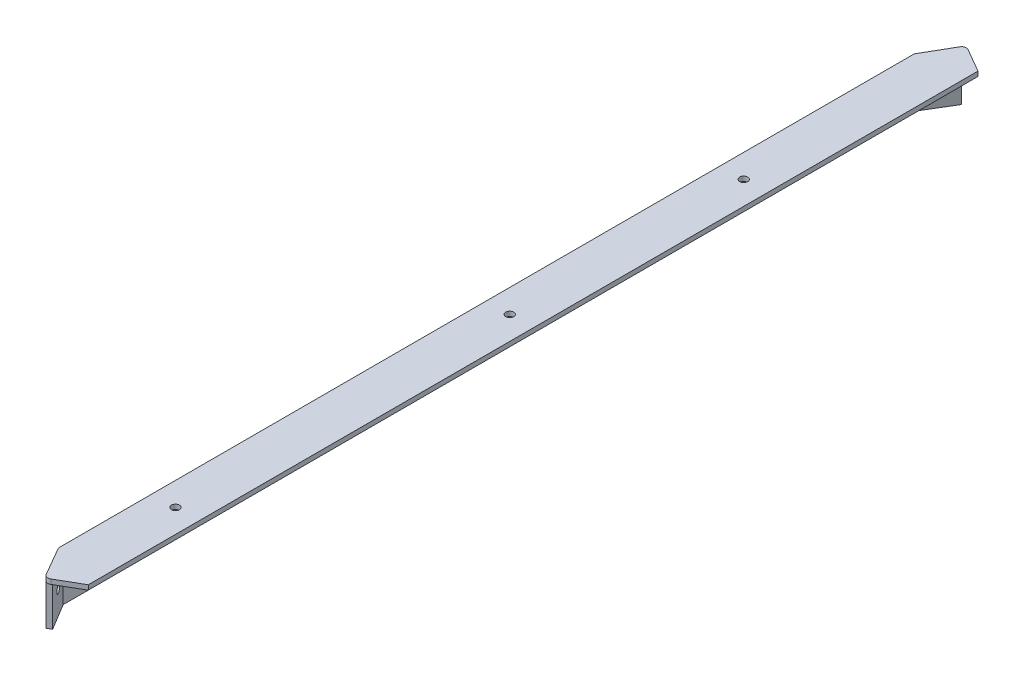
ISO-10303-21;
HEADER;
FILE_DESCRIPTION(('STEP AP214'),'2;1');
FILE_NAME('part.step','',(''),(''),'','','');
FILE_SCHEMA(('AUTOMOTIVE_DESIGN { 1 0 10303 214 1 1 1 1 }'));
ENDSEC;
DATA;
#1=APPLICATION_CONTEXT('core data for automotive mechanical design processes');
#2=APPLICATION_PROTOCOL_DEFINITION('international standard','automotive_design',2000,#1);
#3=PRODUCT_CONTEXT('',#1,'mechanical');
#4=PRODUCT('Part','Part','',(#3));
#5=PRODUCT_RELATED_PRODUCT_CATEGORY('part','',(#4));
#6=PRODUCT_DEFINITION_FORMATION('','',#4);
#7=PRODUCT_DEFINITION_CONTEXT('part definition',#1,'design');
#8=PRODUCT_DEFINITION('design','',#6,#7);
#9=PRODUCT_DEFINITION_SHAPE('','',#8);
#10=(LENGTH_UNIT() NAMED_UNIT(*) SI_UNIT(.MILLI.,.METRE.));
#11=(NAMED_UNIT(*) PLANE_ANGLE_UNIT() SI_UNIT($,.RADIAN.));
#12=(NAMED_UNIT(*) SI_UNIT($,.STERADIAN.) SOLID_ANGLE_UNIT());
#13=UNCERTAINTY_MEASURE_WITH_UNIT(LENGTH_MEASURE(1.E-05),#10,'distance_accuracy_value','');
#14=(GEOMETRIC_REPRESENTATION_CONTEXT(3) GLOBAL_UNCERTAINTY_ASSIGNED_CONTEXT((#13)) GLOBAL_UNIT_ASSIGNED_CONTEXT((#10,
#11,#12)) REPRESENTATION_CONTEXT('',''));
#15=CARTESIAN_POINT('',(0.,0.,0.));
#16=DIRECTION('',(0.,0.,1.));
#17=DIRECTION('',(1.,0.,0.));
#18=AXIS2_PLACEMENT_3D('',#15,#16,#17);
#19=CARTESIAN_POINT('',(7.,0.,640.));
#20=DIRECTION('',(0.,1.,0.));
#21=DIRECTION('',(-1.,0.,0.));
#22=AXIS2_PLACEMENT_3D('',#19,#20,#21);
#23=PLANE('',#22);
#24=DIRECTION('',(0.,0.,-1.));
#25=VECTOR('',#24,1.);
#26=CARTESIAN_POINT('',(0.,0.,640.));
#27=LINE('',#26,#25);
#28=CARTESIAN_POINT('',(0.,0.,640.));
#29=VERTEX_POINT('',#28);
#30=CARTESIAN_POINT('',(0.,0.,-640.));
#31=VERTEX_POINT('',#30);
#32=EDGE_CURVE('E305',#29,#31,#27,.T.);
#33=ORIENTED_EDGE('',*,*,#32,.T.);
#34=DIRECTION('',(0.499999999999995,0.,-0.866025403784441));
#35=VECTOR('',#34,1.);
#36=CARTESIAN_POINT('',(0.,0.,-640.));
#37=LINE('',#36,#35);
#38=CARTESIAN_POINT('',(24.9999999999997,0.,-683.301270189222));
#39=VERTEX_POINT('',#38);
#40=EDGE_CURVE('E164',#31,#39,#37,.T.);
#41=ORIENTED_EDGE('',*,*,#40,.T.);
#42=DIRECTION('',(0.86602540378444,0.,0.499999999999997));
#43=VECTOR('',#42,1.);
#44=CARTESIAN_POINT('',(24.9999999999997,0.,-683.301270189222));
#45=LINE('',#44,#43);
#46=CARTESIAN_POINT('',(31.0621778264906,0.,-679.801270189222));
#47=VERTEX_POINT('',#46);
#48=EDGE_CURVE('E208',#39,#47,#45,.T.);
#49=ORIENTED_EDGE('',*,*,#48,.T.);
#50=DIRECTION('',(-0.517360980401763,0.,0.855767267402608));
#51=VECTOR('',#50,1.);
#52=CARTESIAN_POINT('',(31.0621778264906,0.,-679.801270189222));
#53=LINE('',#52,#51);
#54=CARTESIAN_POINT('',(7.,0.,-640.));
#55=VERTEX_POINT('',#54);
#56=EDGE_CURVE('E204',#47,#55,#53,.T.);
#57=ORIENTED_EDGE('',*,*,#56,.T.);
#58=DIRECTION('',(0.,0.,-1.));
#59=VECTOR('',#58,1.);
#60=CARTESIAN_POINT('',(7.,0.,640.));
#61=LINE('',#60,#59);
#62=CARTESIAN_POINT('',(7.,0.,640.));
#63=VERTEX_POINT('',#62);
#64=EDGE_CURVE('E317',#63,#55,#61,.T.);
#65=ORIENTED_EDGE('',*,*,#64,.F.);
#66=DIRECTION('',(-0.517360980401763,0.,-0.855767267402608));
#67=VECTOR('',#66,1.);
#68=CARTESIAN_POINT('',(31.0621778264906,0.,679.801270189222));
#69=LINE('',#68,#67);
#70=CARTESIAN_POINT('',(31.0621778264906,0.,679.801270189222));
#71=VERTEX_POINT('',#70);
#72=EDGE_CURVE('E283',#71,#63,#69,.T.);
#73=ORIENTED_EDGE('',*,*,#72,.F.);
#74=DIRECTION('',(0.86602540378444,0.,-0.499999999999997));
#75=VECTOR('',#74,1.);
#76=CARTESIAN_POINT('',(24.9999999999997,0.,683.301270189222));
#77=LINE('',#76,#75);
#78=CARTESIAN_POINT('',(24.9999999999997,0.,683.301270189222));
#79=VERTEX_POINT('',#78);
#80=EDGE_CURVE('E286',#79,#71,#77,.T.);
#81=ORIENTED_EDGE('',*,*,#80,.F.);
#82=DIRECTION('',(0.499999999999995,0.,0.866025403784441));
#83=VECTOR('',#82,1.);
#84=CARTESIAN_POINT('',(0.,0.,640.));
#85=LINE('',#84,#83);
#86=EDGE_CURVE('E278',#29,#79,#85,.T.);
#87=ORIENTED_EDGE('',*,*,#86,.F.);
#88=EDGE_LOOP('',(#33,#41,#49,#57,#65,#73,#81,#87));
#89=FACE_BOUND('',#88,.T.);
#90=ADVANCED_FACE('F44',(#89),#23,.F.);
#91=CARTESIAN_POINT('',(6.99999999999999,63.,640.));
#92=DIRECTION('',(-1.,0.,0.));
#93=DIRECTION('',(0.,-1.,0.));
#94=AXIS2_PLACEMENT_3D('',#91,#92,#93);
#95=PLANE('',#94);
#96=ORIENTED_EDGE('',*,*,#64,.T.);
#97=DIRECTION('',(0.,1.,0.));
#98=VECTOR('',#97,1.);
#99=CARTESIAN_POINT('',(6.99999999999999,63.,-640.));
#100=LINE('',#99,#98);
#101=CARTESIAN_POINT('',(6.99999999999999,58.,-640.));
#102=VERTEX_POINT('',#101);
#103=EDGE_CURVE('E220',#55,#102,#100,.T.);
#104=ORIENTED_EDGE('',*,*,#103,.T.);
#105=DIRECTION('',(0.,0.,-1.));
#106=VECTOR('',#105,1.);
#107=CARTESIAN_POINT('',(6.99999999999999,58.,640.));
#108=LINE('',#107,#106);
#109=CARTESIAN_POINT('',(6.99999999999999,58.,640.));
#110=VERTEX_POINT('',#109);
#111=EDGE_CURVE('E54',#102,#110,#108,.F.);
#112=ORIENTED_EDGE('',*,*,#111,.T.);
#113=DIRECTION('',(0.,1.,0.));
#114=VECTOR('',#113,1.);
#115=CARTESIAN_POINT('',(6.99999999999999,63.,640.));
#116=LINE('',#115,#114);
#117=EDGE_CURVE('E299',#63,#110,#116,.T.);
#118=ORIENTED_EDGE('',*,*,#117,.F.);
#119=EDGE_LOOP('',(#96,#104,#112,#118));
#120=FACE_BOUND('',#119,.T.);
#121=ADVANCED_FACE('F355',(#120),#95,.F.);
#122=CARTESIAN_POINT('',(70.,63.,640.));
#123=DIRECTION('',(0.,1.,0.));
#124=DIRECTION('',(-1.,0.,0.));
#125=AXIS2_PLACEMENT_3D('',#122,#123,#124);
#126=PLANE('',#125);
#127=CARTESIAN_POINT('',(35.,63.,500.));
#128=DIRECTION('',(0.,1.,0.));
#129=DIRECTION('',(-1.,0.,0.));
#130=AXIS2_PLACEMENT_3D('',#127,#128,#129);
#131=CIRCLE('',#130,6.);
#132=CARTESIAN_POINT('',(29.,63.,500.));
#133=VERTEX_POINT('',#132);
#134=EDGE_CURVE('E240',#133,#133,#131,.T.);
#135=ORIENTED_EDGE('',*,*,#134,.T.);
#136=EDGE_LOOP('',(#135));
#137=FACE_BOUND('',#136,.T.);
#138=CARTESIAN_POINT('',(35.,63.,-350.));
#139=DIRECTION('',(0.,1.,0.));
#140=DIRECTION('',(-1.,0.,0.));
#141=AXIS2_PLACEMENT_3D('',#138,#139,#140);
#142=CIRCLE('',#141,6.);
#143=CARTESIAN_POINT('',(29.,63.,-350.));
#144=VERTEX_POINT('',#143);
#145=EDGE_CURVE('E551',#144,#144,#142,.T.);
#146=ORIENTED_EDGE('',*,*,#145,.T.);
#147=EDGE_LOOP('',(#146));
#148=FACE_BOUND('',#147,.T.);
#149=CARTESIAN_POINT('',(35.,63.,0.));
#150=DIRECTION('',(0.,1.,0.));
#151=DIRECTION('',(-1.,0.,0.));
#152=AXIS2_PLACEMENT_3D('',#149,#150,#151);
#153=CIRCLE('',#152,6.);
#154=CARTESIAN_POINT('',(29.,63.,0.));
#155=VERTEX_POINT('',#154);
#156=EDGE_CURVE('E555',#155,#155,#153,.T.);
#157=ORIENTED_EDGE('',*,*,#156,.T.);
#158=EDGE_LOOP('',(#157));
#159=FACE_BOUND('',#158,.T.);
#160=DIRECTION('',(0.86602540378444,0.,-0.499999999999997));
#161=VECTOR('',#160,1.);
#162=CARTESIAN_POINT('',(24.9999999999997,63.,683.301270189222));
#163=LINE('',#162,#161);
#164=CARTESIAN_POINT('',(24.9999999999997,63.,683.301270189222));
#165=VERTEX_POINT('',#164);
#166=CARTESIAN_POINT('',(35.3931854107218,63.,677.300761794604));
#167=VERTEX_POINT('',#166);
#168=EDGE_CURVE('E279',#165,#167,#163,.T.);
#169=ORIENTED_EDGE('',*,*,#168,.T.);
#170=DIRECTION('',(-0.517360980401763,0.,-0.855767267402608));
#171=VECTOR('',#170,1.);
#172=CARTESIAN_POINT('',(11.278836337013,63.,637.413195097991));
#173=LINE('',#172,#171);
#174=CARTESIAN_POINT('',(12.,63.,638.606072567694));
#175=VERTEX_POINT('',#174);
#176=EDGE_CURVE('E323',#167,#175,#173,.T.);
#177=ORIENTED_EDGE('',*,*,#176,.T.);
#178=DIRECTION('',(0.,0.,-1.));
#179=VECTOR('',#178,1.);
#180=CARTESIAN_POINT('',(12.,63.,0.));
#181=LINE('',#180,#179);
#182=CARTESIAN_POINT('',(12.,63.,-638.606072567694));
#183=VERTEX_POINT('',#182);
#184=EDGE_CURVE('E320',#175,#183,#181,.T.);
#185=ORIENTED_EDGE('',*,*,#184,.T.);
#186=DIRECTION('',(-0.517360980401763,0.,0.855767267402608));
#187=VECTOR('',#186,1.);
#188=CARTESIAN_POINT('',(11.278836337013,63.,-637.413195097991));
#189=LINE('',#188,#187);
#190=CARTESIAN_POINT('',(35.3931854107218,63.,-677.300761794604));
#191=VERTEX_POINT('',#190);
#192=EDGE_CURVE('E225',#191,#183,#189,.T.);
#193=ORIENTED_EDGE('',*,*,#192,.F.);
#194=DIRECTION('',(0.86602540378444,0.,0.499999999999997));
#195=VECTOR('',#194,1.);
#196=CARTESIAN_POINT('',(24.9999999999997,63.,-683.301270189222));
#197=LINE('',#196,#195);
#198=CARTESIAN_POINT('',(24.9999999999997,63.,-683.301270189222));
#199=VERTEX_POINT('',#198);
#200=EDGE_CURVE('E199',#199,#191,#197,.T.);
#201=ORIENTED_EDGE('',*,*,#200,.F.);
#202=CARTESIAN_POINT('',(31.0621778264908,63.,-679.801270189222));
#203=DIRECTION('',(0.,-1.,0.));
#204=DIRECTION('',(0.,0.,-1.));
#205=AXIS2_PLACEMENT_3D('',#202,#203,#204);
#206=CIRCLE('',#205,7.00000000000002);
#207=CARTESIAN_POINT('',(34.5621778264908,63.,-685.863448015713));
#208=VERTEX_POINT('',#207);
#209=EDGE_CURVE('E160',#199,#208,#206,.T.);
#210=ORIENTED_EDGE('',*,*,#209,.T.);
#211=DIRECTION('',(0.866025403784439,0.,0.499999999999999));
#212=VECTOR('',#211,1.);
#213=CARTESIAN_POINT('',(34.5621778264908,63.,-685.863448015713));
#214=LINE('',#213,#212);
#215=CARTESIAN_POINT('',(69.9999999999999,63.,-665.403411844344));
#216=VERTEX_POINT('',#215);
#217=EDGE_CURVE('E176',#208,#216,#214,.T.);
#218=ORIENTED_EDGE('',*,*,#217,.T.);
#219=DIRECTION('',(0.,0.,-1.));
#220=VECTOR('',#219,1.);
#221=CARTESIAN_POINT('',(70.,63.,640.));
#222=LINE('',#221,#220);
#223=CARTESIAN_POINT('',(69.9999999999999,63.,665.403411844344));
#224=VERTEX_POINT('',#223);
#225=EDGE_CURVE('E314',#224,#216,#222,.T.);
#226=ORIENTED_EDGE('',*,*,#225,.F.);
#227=DIRECTION('',(0.866025403784439,0.,-0.499999999999999));
#228=VECTOR('',#227,1.);
#229=CARTESIAN_POINT('',(34.5621778264908,63.,685.863448015713));
#230=LINE('',#229,#228);
#231=CARTESIAN_POINT('',(34.5621778264908,63.,685.863448015713));
#232=VERTEX_POINT('',#231);
#233=EDGE_CURVE('E254',#232,#224,#230,.T.);
#234=ORIENTED_EDGE('',*,*,#233,.F.);
#235=CARTESIAN_POINT('',(31.0621778264908,63.,679.801270189222));
#236=DIRECTION('',(0.,1.,0.));
#237=DIRECTION('',(0.,0.,1.));
#238=AXIS2_PLACEMENT_3D('',#235,#236,#237);
#239=CIRCLE('',#238,7.00000000000002);
#240=EDGE_CURVE('E249',#165,#232,#239,.T.);
#241=ORIENTED_EDGE('',*,*,#240,.F.);
#242=EDGE_LOOP('',(#169,#177,#185,#193,#201,#210,#218,#226,#234,#241));
#243=FACE_BOUND('',#242,.T.);
#244=ADVANCED_FACE('F341',(#137,#148,#159,#243),#126,.F.);
#245=CARTESIAN_POINT('',(70.,70.,640.));
#246=DIRECTION('',(-1.,0.,0.));
#247=DIRECTION('',(0.,0.,1.));
#248=AXIS2_PLACEMENT_3D('',#245,#246,#247);
#249=PLANE('',#248);
#250=ORIENTED_EDGE('',*,*,#225,.T.);
#251=DIRECTION('',(0.,-1.,0.));
#252=VECTOR('',#251,1.);
#253=CARTESIAN_POINT('',(69.9999999999999,70.,-665.403411844344));
#254=LINE('',#253,#252);
#255=CARTESIAN_POINT('',(69.9999999999999,70.,-665.403411844344));
#256=VERTEX_POINT('',#255);
#257=EDGE_CURVE('E184',#256,#216,#254,.T.);
#258=ORIENTED_EDGE('',*,*,#257,.F.);
#259=DIRECTION('',(0.,0.,-1.));
#260=VECTOR('',#259,1.);
#261=CARTESIAN_POINT('',(70.,70.,640.));
#262=LINE('',#261,#260);
#263=CARTESIAN_POINT('',(69.9999999999999,70.,665.403411844344));
#264=VERTEX_POINT('',#263);
#265=EDGE_CURVE('E311',#264,#256,#262,.T.);
#266=ORIENTED_EDGE('',*,*,#265,.F.);
#267=DIRECTION('',(0.,-1.,0.));
#268=VECTOR('',#267,1.);
#269=CARTESIAN_POINT('',(69.9999999999999,70.,665.403411844344));
#270=LINE('',#269,#268);
#271=EDGE_CURVE('E261',#264,#224,#270,.T.);
#272=ORIENTED_EDGE('',*,*,#271,.T.);
#273=EDGE_LOOP('',(#250,#258,#266,#272));
#274=FACE_BOUND('',#273,.T.);
#275=ADVANCED_FACE('F387',(#274),#249,.F.);
#276=CARTESIAN_POINT('',(0.,70.,640.));
#277=DIRECTION('',(0.,-1.,0.));
#278=DIRECTION('',(0.,0.,-1.));
#279=AXIS2_PLACEMENT_3D('',#276,#277,#278);
#280=PLANE('',#279);
#281=CARTESIAN_POINT('',(35.,70.,500.));
#282=DIRECTION('',(0.,1.,0.));
#283=DIRECTION('',(0.,0.,1.));
#284=AXIS2_PLACEMENT_3D('',#281,#282,#283);
#285=CIRCLE('',#284,6.);
#286=CARTESIAN_POINT('',(35.,70.,506.));
#287=VERTEX_POINT('',#286);
#288=EDGE_CURVE('E547',#287,#287,#285,.T.);
#289=ORIENTED_EDGE('',*,*,#288,.F.);
#290=EDGE_LOOP('',(#289));
#291=FACE_BOUND('',#290,.T.);
#292=CARTESIAN_POINT('',(35.,70.,-350.));
#293=DIRECTION('',(0.,1.,0.));
#294=DIRECTION('',(0.,0.,1.));
#295=AXIS2_PLACEMENT_3D('',#292,#293,#294);
#296=CIRCLE('',#295,6.);
#297=CARTESIAN_POINT('',(35.,70.,-344.));
#298=VERTEX_POINT('',#297);
#299=EDGE_CURVE('E573',#298,#298,#296,.T.);
#300=ORIENTED_EDGE('',*,*,#299,.F.);
#301=EDGE_LOOP('',(#300));
#302=FACE_BOUND('',#301,.T.);
#303=CARTESIAN_POINT('',(35.,70.,0.));
#304=DIRECTION('',(0.,1.,0.));
#305=DIRECTION('',(0.,0.,1.));
#306=AXIS2_PLACEMENT_3D('',#303,#304,#305);
#307=CIRCLE('',#306,6.);
#308=CARTESIAN_POINT('',(35.,70.,6.));
#309=VERTEX_POINT('',#308);
#310=EDGE_CURVE('E569',#309,#309,#307,.T.);
#311=ORIENTED_EDGE('',*,*,#310,.F.);
#312=EDGE_LOOP('',(#311));
#313=FACE_BOUND('',#312,.T.);
#314=ORIENTED_EDGE('',*,*,#265,.T.);
#315=DIRECTION('',(0.866025403784439,0.,0.499999999999999));
#316=VECTOR('',#315,1.);
#317=CARTESIAN_POINT('',(34.5621778264908,70.,-685.863448015713));
#318=LINE('',#317,#316);
#319=CARTESIAN_POINT('',(34.5621778264908,70.,-685.863448015713));
#320=VERTEX_POINT('',#319);
#321=EDGE_CURVE('E180',#320,#256,#318,.T.);
#322=ORIENTED_EDGE('',*,*,#321,.F.);
#323=CARTESIAN_POINT('',(31.0621778264908,70.,-679.801270189222));
#324=DIRECTION('',(0.,-1.,0.));
#325=DIRECTION('',(0.,0.,-1.));
#326=AXIS2_PLACEMENT_3D('',#323,#324,#325);
#327=CIRCLE('',#326,7.00000000000002);
#328=CARTESIAN_POINT('',(24.9999999999997,70.,-683.301270189222));
#329=VERTEX_POINT('',#328);
#330=EDGE_CURVE('E157',#329,#320,#327,.T.);
#331=ORIENTED_EDGE('',*,*,#330,.F.);
#332=DIRECTION('',(0.499999999999996,0.,-0.866025403784441));
#333=VECTOR('',#332,1.);
#334=CARTESIAN_POINT('',(0.,70.,-640.));
#335=LINE('',#334,#333);
#336=CARTESIAN_POINT('',(0.,70.,-640.));
#337=VERTEX_POINT('',#336);
#338=EDGE_CURVE('E169',#337,#329,#335,.T.);
#339=ORIENTED_EDGE('',*,*,#338,.F.);
#340=DIRECTION('',(0.,0.,-1.));
#341=VECTOR('',#340,1.);
#342=CARTESIAN_POINT('',(0.,70.,640.));
#343=LINE('',#342,#341);
#344=CARTESIAN_POINT('',(0.,70.,640.));
#345=VERTEX_POINT('',#344);
#346=EDGE_CURVE('E308',#345,#337,#343,.T.);
#347=ORIENTED_EDGE('',*,*,#346,.F.);
#348=DIRECTION('',(0.499999999999996,0.,0.866025403784441));
#349=VECTOR('',#348,1.);
#350=CARTESIAN_POINT('',(0.,70.,640.));
#351=LINE('',#350,#349);
#352=CARTESIAN_POINT('',(24.9999999999997,70.,683.301270189222));
#353=VERTEX_POINT('',#352);
#354=EDGE_CURVE('E250',#345,#353,#351,.T.);
#355=ORIENTED_EDGE('',*,*,#354,.T.);
#356=CARTESIAN_POINT('',(31.0621778264908,70.,679.801270189222));
#357=DIRECTION('',(0.,1.,0.));
#358=DIRECTION('',(0.,0.,1.));
#359=AXIS2_PLACEMENT_3D('',#356,#357,#358);
#360=CIRCLE('',#359,7.00000000000002);
#361=CARTESIAN_POINT('',(34.5621778264908,70.,685.863448015713));
#362=VERTEX_POINT('',#361);
#363=EDGE_CURVE('E253',#353,#362,#360,.T.);
#364=ORIENTED_EDGE('',*,*,#363,.T.);
#365=DIRECTION('',(0.866025403784439,0.,-0.499999999999999));
#366=VECTOR('',#365,1.);
#367=CARTESIAN_POINT('',(34.5621778264908,70.,685.863448015713));
#368=LINE('',#367,#366);
#369=EDGE_CURVE('E257',#362,#264,#368,.T.);
#370=ORIENTED_EDGE('',*,*,#369,.T.);
#371=EDGE_LOOP('',(#314,#322,#331,#339,#347,#355,#364,#370));
#372=FACE_BOUND('',#371,.T.);
#373=ADVANCED_FACE('F178',(#291,#302,#313,#372),#280,.F.);
#374=CARTESIAN_POINT('',(0.,0.,640.));
#375=DIRECTION('',(1.,0.,0.));
#376=DIRECTION('',(0.,0.,-1.));
#377=AXIS2_PLACEMENT_3D('',#374,#375,#376);
#378=PLANE('',#377);
#379=ORIENTED_EDGE('',*,*,#346,.T.);
#380=DIRECTION('',(0.,-1.,0.));
#381=VECTOR('',#380,1.);
#382=CARTESIAN_POINT('',(0.,0.,-640.));
#383=LINE('',#382,#381);
#384=EDGE_CURVE('E173',#337,#31,#383,.T.);
#385=ORIENTED_EDGE('',*,*,#384,.T.);
#386=ORIENTED_EDGE('',*,*,#32,.F.);
#387=DIRECTION('',(0.,-1.,0.));
#388=VECTOR('',#387,1.);
#389=CARTESIAN_POINT('',(0.,0.,640.));
#390=LINE('',#389,#388);
#391=EDGE_CURVE('E302',#345,#29,#390,.T.);
#392=ORIENTED_EDGE('',*,*,#391,.F.);
#393=EDGE_LOOP('',(#379,#385,#386,#392));
#394=FACE_BOUND('',#393,.T.);
#395=ADVANCED_FACE('F369',(#394),#378,.F.);
#396=CARTESIAN_POINT('',(0.,63.,640.));
#397=DIRECTION('',(0.866025403784441,0.,-0.499999999999995));
#398=DIRECTION('',(-0.499999999999995,0.,-0.866025403784441));
#399=AXIS2_PLACEMENT_3D('',#396,#397,#398);
#400=PLANE('',#399);
#401=CARTESIAN_POINT('',(12.5680467926569,35.,661.768495596785));
#402=DIRECTION('',(0.866025403784441,0.,-0.499999999999995));
#403=DIRECTION('',(-0.499999999999995,0.,-0.866025403784441));
#404=AXIS2_PLACEMENT_3D('',#401,#402,#403);
#405=ELLIPSE('',#404,6.00122014708363,5.99999999999997);
#406=CARTESIAN_POINT('',(9.56743671911515,35.,656.571286495708));
#407=VERTEX_POINT('',#406);
#408=EDGE_CURVE('E245',#407,#407,#405,.T.);
#409=ORIENTED_EDGE('',*,*,#408,.T.);
#410=EDGE_LOOP('',(#409));
#411=FACE_BOUND('',#410,.T.);
#412=ORIENTED_EDGE('',*,*,#86,.T.);
#413=DIRECTION('',(0.,-1.,0.));
#414=VECTOR('',#413,1.);
#415=CARTESIAN_POINT('',(24.9999999999997,63.,683.301270189222));
#416=LINE('',#415,#414);
#417=EDGE_CURVE('E295',#165,#79,#416,.T.);
#418=ORIENTED_EDGE('',*,*,#417,.F.);
#419=DIRECTION('',(0.,-1.,0.));
#420=VECTOR('',#419,1.);
#421=CARTESIAN_POINT('',(24.9999999999997,70.,683.301270189222));
#422=LINE('',#421,#420);
#423=EDGE_CURVE('E274',#353,#165,#422,.T.);
#424=ORIENTED_EDGE('',*,*,#423,.F.);
#425=ORIENTED_EDGE('',*,*,#354,.F.);
#426=ORIENTED_EDGE('',*,*,#391,.T.);
#427=EDGE_LOOP('',(#412,#418,#424,#425,#426));
#428=FACE_BOUND('',#427,.T.);
#429=ADVANCED_FACE('F375',(#411,#428),#400,.F.);
#430=CARTESIAN_POINT('',(24.9999999999997,63.,683.301270189222));
#431=DIRECTION('',(-0.499999999999997,0.,-0.86602540378444));
#432=DIRECTION('',(-0.86602540378444,0.,0.499999999999997));
#433=AXIS2_PLACEMENT_3D('',#430,#431,#432);
#434=PLANE('',#433);
#435=ORIENTED_EDGE('',*,*,#80,.T.);
#436=DIRECTION('',(0.,-1.,0.));
#437=VECTOR('',#436,1.);
#438=CARTESIAN_POINT('',(31.0621778264906,63.,679.801270189222));
#439=LINE('',#438,#437);
#440=CARTESIAN_POINT('',(31.0621778264906,58.,679.801270189222));
#441=VERTEX_POINT('',#440);
#442=EDGE_CURVE('E282',#441,#71,#439,.T.);
#443=ORIENTED_EDGE('',*,*,#442,.F.);
#444=CARTESIAN_POINT('',(35.3931854107218,58.,677.300761794604));
#445=DIRECTION('',(-0.499999999999997,0.,-0.86602540378444));
#446=DIRECTION('',(0.86602540378444,0.,-0.499999999999997));
#447=AXIS2_PLACEMENT_3D('',#444,#445,#446);
#448=ELLIPSE('',#447,5.00101678923638,5.);
#449=EDGE_CURVE('E11',#441,#167,#448,.T.);
#450=ORIENTED_EDGE('',*,*,#449,.T.);
#451=ORIENTED_EDGE('',*,*,#168,.F.);
#452=ORIENTED_EDGE('',*,*,#417,.T.);
#453=EDGE_LOOP('',(#435,#443,#450,#451,#452));
#454=FACE_BOUND('',#453,.T.);
#455=ADVANCED_FACE('F346',(#454),#434,.F.);
#456=CARTESIAN_POINT('',(31.0621778264906,63.,679.801270189222));
#457=DIRECTION('',(-0.855767267402608,0.,0.517360980401763));
#458=DIRECTION('',(0.517360980401763,0.,0.855767267402608));
#459=AXIS2_PLACEMENT_3D('',#456,#457,#458);
#460=PLANE('',#459);
#461=CARTESIAN_POINT('',(18.1281533164464,35.,658.407088504157));
#462=DIRECTION('',(0.855767267402608,0.,-0.517360980401763));
#463=DIRECTION('',(-0.517360980401763,0.,-0.855767267402608));
#464=AXIS2_PLACEMENT_3D('',#461,#462,#463);
#465=CIRCLE('',#464,5.99999999999997);
#466=CARTESIAN_POINT('',(15.0239874340358,35.,653.272484899742));
#467=VERTEX_POINT('',#466);
#468=EDGE_CURVE('E241',#467,#467,#465,.T.);
#469=ORIENTED_EDGE('',*,*,#468,.F.);
#470=EDGE_LOOP('',(#469));
#471=FACE_BOUND('',#470,.T.);
#472=ORIENTED_EDGE('',*,*,#117,.T.);
#473=DIRECTION('',(-0.517360980401763,0.,-0.855767267402608));
#474=VECTOR('',#473,1.);
#475=CARTESIAN_POINT('',(31.0621778264906,58.,679.801270189222));
#476=LINE('',#475,#474);
#477=EDGE_CURVE('E61',#110,#441,#476,.F.);
#478=ORIENTED_EDGE('',*,*,#477,.T.);
#479=ORIENTED_EDGE('',*,*,#442,.T.);
#480=ORIENTED_EDGE('',*,*,#72,.T.);
#481=EDGE_LOOP('',(#472,#478,#479,#480));
#482=FACE_BOUND('',#481,.T.);
#483=ADVANCED_FACE('F349',(#471,#482),#460,.F.);
#484=CARTESIAN_POINT('',(31.0621778264908,70.,679.801270189222));
#485=DIRECTION('',(0.,-1.,0.));
#486=DIRECTION('',(0.,0.,-1.));
#487=AXIS2_PLACEMENT_3D('',#484,#485,#486);
#488=CYLINDRICAL_SURFACE('',#487,7.00000000000002);
#489=ORIENTED_EDGE('',*,*,#240,.T.);
#490=DIRECTION('',(0.,-1.,0.));
#491=VECTOR('',#490,1.);
#492=CARTESIAN_POINT('',(34.5621778264908,70.,685.863448015713));
#493=LINE('',#492,#491);
#494=EDGE_CURVE('E270',#362,#232,#493,.T.);
#495=ORIENTED_EDGE('',*,*,#494,.F.);
#496=ORIENTED_EDGE('',*,*,#363,.F.);
#497=ORIENTED_EDGE('',*,*,#423,.T.);
#498=EDGE_LOOP('',(#489,#495,#496,#497));
#499=FACE_BOUND('',#498,.T.);
#500=ADVANCED_FACE('F377',(#499),#488,.T.);
#501=CARTESIAN_POINT('',(34.5621778264908,70.,685.863448015713));
#502=DIRECTION('',(-0.499999999999999,0.,-0.866025403784439));
#503=DIRECTION('',(-0.86602540378444,0.,0.499999999999999));
#504=AXIS2_PLACEMENT_3D('',#501,#502,#503);
#505=PLANE('',#504);
#506=ORIENTED_EDGE('',*,*,#233,.T.);
#507=ORIENTED_EDGE('',*,*,#271,.F.);
#508=ORIENTED_EDGE('',*,*,#369,.F.);
#509=ORIENTED_EDGE('',*,*,#494,.T.);
#510=EDGE_LOOP('',(#506,#507,#508,#509));
#511=FACE_BOUND('',#510,.T.);
#512=ADVANCED_FACE('F381',(#511),#505,.F.);
#513=CARTESIAN_POINT('',(12.1377824446282,35.,662.02861536697));
#514=DIRECTION('',(0.855767267402608,0.,-0.517360980401763));
#515=DIRECTION('',(-0.517360980401763,0.,-0.855767267402608));
#516=AXIS2_PLACEMENT_3D('',#513,#514,#515);
#517=CYLINDRICAL_SURFACE('',#516,5.99999999999997);
#518=ORIENTED_EDGE('',*,*,#468,.T.);
#519=EDGE_LOOP('',(#518));
#520=FACE_BOUND('',#519,.T.);
#521=ORIENTED_EDGE('',*,*,#408,.F.);
#522=EDGE_LOOP('',(#521));
#523=FACE_BOUND('',#522,.T.);
#524=ADVANCED_FACE('F415',(#520,#523),#517,.F.);
#525=CARTESIAN_POINT('',(12.,58.,640.));
#526=DIRECTION('',(0.,0.,1.));
#527=DIRECTION('',(1.,0.,0.));
#528=AXIS2_PLACEMENT_3D('',#525,#526,#527);
#529=CYLINDRICAL_SURFACE('',#528,5.);
#530=ORIENTED_EDGE('',*,*,#111,.F.);
#531=CARTESIAN_POINT('',(12.,58.,-638.606072567694));
#532=DIRECTION('',(-0.268544905553422,0.,0.963267166315402));
#533=DIRECTION('',(0.963267166315402,0.,0.268544905553422));
#534=AXIS2_PLACEMENT_3D('',#531,#532,#533);
#535=ELLIPSE('',#534,5.19066794223406,5.);
#536=EDGE_CURVE('E235',#102,#183,#535,.F.);
#537=ORIENTED_EDGE('',*,*,#536,.T.);
#538=ORIENTED_EDGE('',*,*,#184,.F.);
#539=CARTESIAN_POINT('',(12.,58.,638.606072567694));
#540=DIRECTION('',(0.268544905553422,0.,0.963267166315402));
#541=DIRECTION('',(0.963267166315402,0.,-0.268544905553422));
#542=AXIS2_PLACEMENT_3D('',#539,#540,#541);
#543=ELLIPSE('',#542,5.19066794223406,5.);
#544=EDGE_CURVE('E48',#110,#175,#543,.F.);
#545=ORIENTED_EDGE('',*,*,#544,.F.);
#546=EDGE_LOOP('',(#530,#537,#538,#545));
#547=FACE_BOUND('',#546,.T.);
#548=ADVANCED_FACE('F46',(#547),#529,.F.);
#549=CARTESIAN_POINT('',(28.1415665316763,58.,665.305852422918));
#550=DIRECTION('',(0.517360980401763,0.,0.855767267402608));
#551=DIRECTION('',(0.855767267402608,0.,-0.517360980401763));
#552=AXIS2_PLACEMENT_3D('',#549,#550,#551);
#553=CYLINDRICAL_SURFACE('',#552,5.);
#554=ORIENTED_EDGE('',*,*,#449,.F.);
#555=ORIENTED_EDGE('',*,*,#477,.F.);
#556=ORIENTED_EDGE('',*,*,#544,.T.);
#557=ORIENTED_EDGE('',*,*,#176,.F.);
#558=EDGE_LOOP('',(#554,#555,#556,#557));
#559=FACE_BOUND('',#558,.T.);
#560=ADVANCED_FACE('F336',(#559),#553,.F.);
#561=CARTESIAN_POINT('',(0.,63.,-640.));
#562=DIRECTION('',(0.866025403784441,0.,0.499999999999995));
#563=DIRECTION('',(-0.499999999999995,0.,0.866025403784441));
#564=AXIS2_PLACEMENT_3D('',#561,#562,#563);
#565=PLANE('',#564);
#566=CARTESIAN_POINT('',(12.5680467926569,35.,-661.768495596785));
#567=DIRECTION('',(-0.866025403784441,0.,-0.499999999999995));
#568=DIRECTION('',(-0.499999999999995,0.,0.866025403784441));
#569=AXIS2_PLACEMENT_3D('',#566,#567,#568);
#570=ELLIPSE('',#569,6.00122014708363,5.99999999999997);
#571=CARTESIAN_POINT('',(9.56743671911515,35.,-656.571286495708));
#572=VERTEX_POINT('',#571);
#573=EDGE_CURVE('E190',#572,#572,#570,.T.);
#574=ORIENTED_EDGE('',*,*,#573,.F.);
#575=EDGE_LOOP('',(#574));
#576=FACE_BOUND('',#575,.T.);
#577=ORIENTED_EDGE('',*,*,#40,.F.);
#578=ORIENTED_EDGE('',*,*,#384,.F.);
#579=ORIENTED_EDGE('',*,*,#338,.T.);
#580=DIRECTION('',(0.,-1.,0.));
#581=VECTOR('',#580,1.);
#582=CARTESIAN_POINT('',(24.9999999999997,70.,-683.301270189222));
#583=LINE('',#582,#581);
#584=EDGE_CURVE('E153',#329,#199,#583,.T.);
#585=ORIENTED_EDGE('',*,*,#584,.T.);
#586=DIRECTION('',(0.,-1.,0.));
#587=VECTOR('',#586,1.);
#588=CARTESIAN_POINT('',(24.9999999999997,63.,-683.301270189222));
#589=LINE('',#588,#587);
#590=EDGE_CURVE('E217',#199,#39,#589,.T.);
#591=ORIENTED_EDGE('',*,*,#590,.T.);
#592=EDGE_LOOP('',(#577,#578,#579,#585,#591));
#593=FACE_BOUND('',#592,.T.);
#594=ADVANCED_FACE('F171',(#576,#593),#565,.F.);
#595=CARTESIAN_POINT('',(24.9999999999997,63.,-683.301270189222));
#596=DIRECTION('',(-0.499999999999997,0.,0.86602540378444));
#597=DIRECTION('',(-0.86602540378444,0.,-0.499999999999997));
#598=AXIS2_PLACEMENT_3D('',#595,#596,#597);
#599=PLANE('',#598);
#600=ORIENTED_EDGE('',*,*,#48,.F.);
#601=ORIENTED_EDGE('',*,*,#590,.F.);
#602=ORIENTED_EDGE('',*,*,#200,.T.);
#603=CARTESIAN_POINT('',(35.3931854107218,58.,-677.300761794604));
#604=DIRECTION('',(0.499999999999997,0.,-0.86602540378444));
#605=DIRECTION('',(0.86602540378444,0.,0.499999999999997));
#606=AXIS2_PLACEMENT_3D('',#603,#604,#605);
#607=ELLIPSE('',#606,5.00101678923638,5.);
#608=CARTESIAN_POINT('',(31.0621778264906,58.,-679.801270189222));
#609=VERTEX_POINT('',#608);
#610=EDGE_CURVE('E232',#609,#191,#607,.T.);
#611=ORIENTED_EDGE('',*,*,#610,.F.);
#612=DIRECTION('',(0.,-1.,0.));
#613=VECTOR('',#612,1.);
#614=CARTESIAN_POINT('',(31.0621778264906,63.,-679.801270189222));
#615=LINE('',#614,#613);
#616=EDGE_CURVE('E203',#609,#47,#615,.T.);
#617=ORIENTED_EDGE('',*,*,#616,.T.);
#618=EDGE_LOOP('',(#600,#601,#602,#611,#617));
#619=FACE_BOUND('',#618,.T.);
#620=ADVANCED_FACE('F365',(#619),#599,.F.);
#621=CARTESIAN_POINT('',(31.0621778264906,63.,-679.801270189222));
#622=DIRECTION('',(-0.855767267402608,0.,-0.517360980401763));
#623=DIRECTION('',(0.517360980401763,0.,-0.855767267402608));
#624=AXIS2_PLACEMENT_3D('',#621,#622,#623);
#625=PLANE('',#624);
#626=CARTESIAN_POINT('',(18.1281533164464,35.,-658.407088504157));
#627=DIRECTION('',(-0.855767267402608,0.,-0.517360980401763));
#628=DIRECTION('',(-0.517360980401763,0.,0.855767267402608));
#629=AXIS2_PLACEMENT_3D('',#626,#627,#628);
#630=CIRCLE('',#629,5.99999999999997);
#631=CARTESIAN_POINT('',(15.0239874340358,35.,-653.272484899742));
#632=VERTEX_POINT('',#631);
#633=EDGE_CURVE('E239',#632,#632,#630,.T.);
#634=ORIENTED_EDGE('',*,*,#633,.T.);
#635=EDGE_LOOP('',(#634));
#636=FACE_BOUND('',#635,.T.);
#637=ORIENTED_EDGE('',*,*,#103,.F.);
#638=ORIENTED_EDGE('',*,*,#56,.F.);
#639=ORIENTED_EDGE('',*,*,#616,.F.);
#640=DIRECTION('',(-0.517360980401763,0.,0.855767267402608));
#641=VECTOR('',#640,1.);
#642=CARTESIAN_POINT('',(31.0621778264906,58.,-679.801270189222));
#643=LINE('',#642,#641);
#644=EDGE_CURVE('E229',#102,#609,#643,.F.);
#645=ORIENTED_EDGE('',*,*,#644,.F.);
#646=EDGE_LOOP('',(#637,#638,#639,#645));
#647=FACE_BOUND('',#646,.T.);
#648=ADVANCED_FACE('F358',(#636,#647),#625,.F.);
#649=CARTESIAN_POINT('',(31.0621778264908,70.,-679.801270189222));
#650=DIRECTION('',(0.,-1.,0.));
#651=DIRECTION('',(0.,0.,1.));
#652=AXIS2_PLACEMENT_3D('',#649,#650,#651);
#653=CYLINDRICAL_SURFACE('',#652,7.00000000000002);
#654=ORIENTED_EDGE('',*,*,#209,.F.);
#655=ORIENTED_EDGE('',*,*,#584,.F.);
#656=ORIENTED_EDGE('',*,*,#330,.T.);
#657=DIRECTION('',(0.,-1.,0.));
#658=VECTOR('',#657,1.);
#659=CARTESIAN_POINT('',(34.5621778264908,70.,-685.863448015713));
#660=LINE('',#659,#658);
#661=EDGE_CURVE('E165',#320,#208,#660,.T.);
#662=ORIENTED_EDGE('',*,*,#661,.T.);
#663=EDGE_LOOP('',(#654,#655,#656,#662));
#664=FACE_BOUND('',#663,.T.);
#665=ADVANCED_FACE('F155',(#664),#653,.T.);
#666=CARTESIAN_POINT('',(34.5621778264908,70.,-685.863448015713));
#667=DIRECTION('',(-0.499999999999999,0.,0.866025403784439));
#668=DIRECTION('',(-0.86602540378444,0.,-0.499999999999999));
#669=AXIS2_PLACEMENT_3D('',#666,#667,#668);
#670=PLANE('',#669);
#671=ORIENTED_EDGE('',*,*,#217,.F.);
#672=ORIENTED_EDGE('',*,*,#661,.F.);
#673=ORIENTED_EDGE('',*,*,#321,.T.);
#674=ORIENTED_EDGE('',*,*,#257,.T.);
#675=EDGE_LOOP('',(#671,#672,#673,#674));
#676=FACE_BOUND('',#675,.T.);
#677=ADVANCED_FACE('F386',(#676),#670,.F.);
#678=CARTESIAN_POINT('',(12.1377824446282,35.,-662.02861536697));
#679=DIRECTION('',(0.855767267402608,0.,0.517360980401763));
#680=DIRECTION('',(-0.517360980401763,0.,0.855767267402608));
#681=AXIS2_PLACEMENT_3D('',#678,#679,#680);
#682=CYLINDRICAL_SURFACE('',#681,5.99999999999997);
#683=ORIENTED_EDGE('',*,*,#633,.F.);
#684=EDGE_LOOP('',(#683));
#685=FACE_BOUND('',#684,.T.);
#686=ORIENTED_EDGE('',*,*,#573,.T.);
#687=EDGE_LOOP('',(#686));
#688=FACE_BOUND('',#687,.T.);
#689=ADVANCED_FACE('F495',(#685,#688),#682,.F.);
#690=CARTESIAN_POINT('',(28.1415665316763,58.,-665.305852422918));
#691=DIRECTION('',(0.517360980401763,0.,-0.855767267402608));
#692=DIRECTION('',(0.855767267402608,0.,0.517360980401763));
#693=AXIS2_PLACEMENT_3D('',#690,#691,#692);
#694=CYLINDRICAL_SURFACE('',#693,5.);
#695=ORIENTED_EDGE('',*,*,#610,.T.);
#696=ORIENTED_EDGE('',*,*,#192,.T.);
#697=ORIENTED_EDGE('',*,*,#536,.F.);
#698=ORIENTED_EDGE('',*,*,#644,.T.);
#699=EDGE_LOOP('',(#695,#696,#697,#698));
#700=FACE_BOUND('',#699,.T.);
#701=ADVANCED_FACE('F362',(#700),#694,.F.);
#702=CARTESIAN_POINT('',(35.,-265.,0.));
#703=DIRECTION('',(0.,1.,0.));
#704=DIRECTION('',(0.,0.,1.));
#705=AXIS2_PLACEMENT_3D('',#702,#703,#704);
#706=CYLINDRICAL_SURFACE('',#705,6.);
#707=ORIENTED_EDGE('',*,*,#310,.T.);
#708=EDGE_LOOP('',(#707));
#709=FACE_BOUND('',#708,.T.);
#710=ORIENTED_EDGE('',*,*,#156,.F.);
#711=EDGE_LOOP('',(#710));
#712=FACE_BOUND('',#711,.T.);
#713=ADVANCED_FACE('F513',(#709,#712),#706,.F.);
#714=CARTESIAN_POINT('',(35.,-265.,-350.));
#715=DIRECTION('',(0.,1.,0.));
#716=DIRECTION('',(0.,0.,1.));
#717=AXIS2_PLACEMENT_3D('',#714,#715,#716);
#718=CYLINDRICAL_SURFACE('',#717,6.);
#719=ORIENTED_EDGE('',*,*,#299,.T.);
#720=EDGE_LOOP('',(#719));
#721=FACE_BOUND('',#720,.T.);
#722=ORIENTED_EDGE('',*,*,#145,.F.);
#723=EDGE_LOOP('',(#722));
#724=FACE_BOUND('',#723,.T.);
#725=ADVANCED_FACE('F521',(#721,#724),#718,.F.);
#726=CARTESIAN_POINT('',(35.,-265.,500.));
#727=DIRECTION('',(0.,1.,0.));
#728=DIRECTION('',(0.,0.,1.));
#729=AXIS2_PLACEMENT_3D('',#726,#727,#728);
#730=CYLINDRICAL_SURFACE('',#729,6.);
#731=ORIENTED_EDGE('',*,*,#288,.T.);
#732=EDGE_LOOP('',(#731));
#733=FACE_BOUND('',#732,.T.);
#734=ORIENTED_EDGE('',*,*,#134,.F.);
#735=EDGE_LOOP('',(#734));
#736=FACE_BOUND('',#735,.T.);
#737=ADVANCED_FACE('F531',(#733,#736),#730,.F.);
#738=CLOSED_SHELL('',(#90,#121,#244,#275,#373,#395,#429,#455,#483,#500,#512,#524,#548,#560,#594,
#620,#648,#665,#677,#689,#701,#713,#725,#737));
#739=MANIFOLD_SOLID_BREP('B2',#738);
#740=ADVANCED_BREP_SHAPE_REPRESENTATION('',(#18,#739),#14);
#741=SHAPE_DEFINITION_REPRESENTATION(#9,#740);
ENDSEC;
END-ISO-10303-21;
